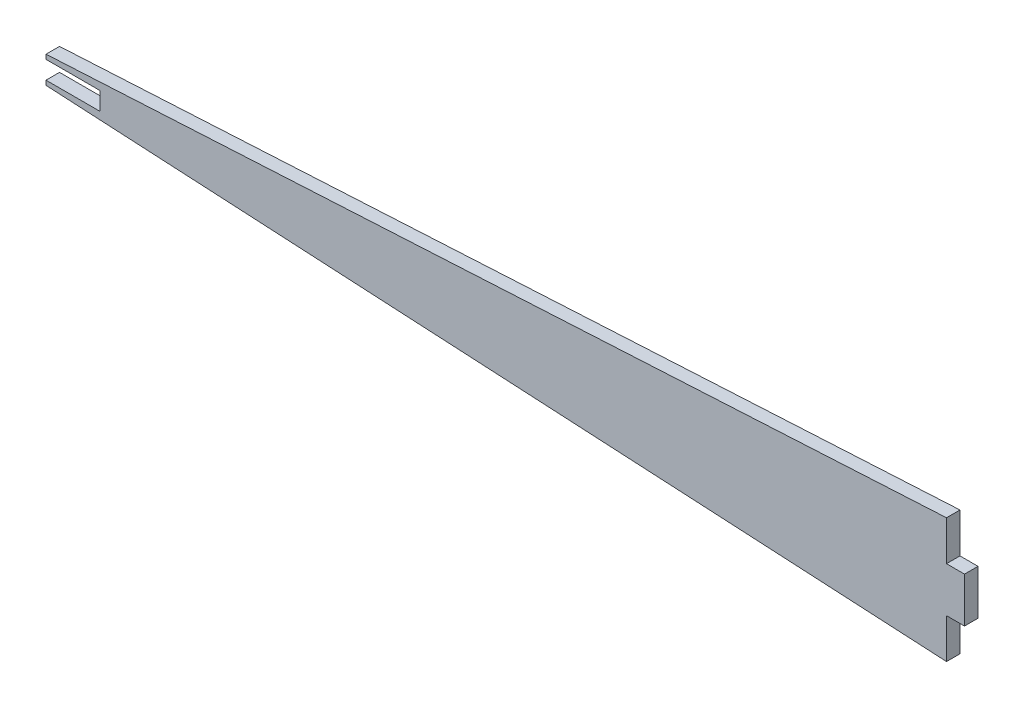
ISO-10303-21;
HEADER;
FILE_DESCRIPTION(('STEP AP214'),'2;1');
FILE_NAME('part.step','',(''),(''),'','','');
FILE_SCHEMA(('AUTOMOTIVE_DESIGN { 1 0 10303 214 1 1 1 1 }'));
ENDSEC;
DATA;
#1=APPLICATION_CONTEXT('core data for automotive mechanical design processes');
#2=APPLICATION_PROTOCOL_DEFINITION('international standard','automotive_design',2000,#1);
#3=PRODUCT_CONTEXT('',#1,'mechanical');
#4=PRODUCT('Part','Part','',(#3));
#5=PRODUCT_RELATED_PRODUCT_CATEGORY('part','',(#4));
#6=PRODUCT_DEFINITION_FORMATION('','',#4);
#7=PRODUCT_DEFINITION_CONTEXT('part definition',#1,'design');
#8=PRODUCT_DEFINITION('design','',#6,#7);
#9=PRODUCT_DEFINITION_SHAPE('','',#8);
#10=(LENGTH_UNIT() NAMED_UNIT(*) SI_UNIT(.MILLI.,.METRE.));
#11=(NAMED_UNIT(*) PLANE_ANGLE_UNIT() SI_UNIT($,.RADIAN.));
#12=(NAMED_UNIT(*) SI_UNIT($,.STERADIAN.) SOLID_ANGLE_UNIT());
#13=UNCERTAINTY_MEASURE_WITH_UNIT(LENGTH_MEASURE(1.E-05),#10,'distance_accuracy_value','');
#14=(GEOMETRIC_REPRESENTATION_CONTEXT(3) GLOBAL_UNCERTAINTY_ASSIGNED_CONTEXT((#13)) GLOBAL_UNIT_ASSIGNED_CONTEXT((#10,
#11,#12)) REPRESENTATION_CONTEXT('',''));
#15=CARTESIAN_POINT('',(0.,0.,0.));
#16=DIRECTION('',(0.,0.,1.));
#17=DIRECTION('',(1.,0.,0.));
#18=AXIS2_PLACEMENT_3D('',#15,#16,#17);
#19=CARTESIAN_POINT('',(100.818561425345,0.588779311900424,1.5));
#20=DIRECTION('',(0.0541045442753656,0.998535276436819,0.));
#21=DIRECTION('',(-0.998535276436819,0.0541045442753657,0.));
#22=AXIS2_PLACEMENT_3D('',#19,#20,#21);
#23=PLANE('',#22);
#24=DIRECTION('',(0.998535276436819,-0.0541045442753657,0.));
#25=VECTOR('',#24,1.);
#26=CARTESIAN_POINT('',(100.818561425345,0.588779311900424,0.));
#27=LINE('',#26,#25);
#28=CARTESIAN_POINT('',(0.75936142534502,6.0103778716186,0.));
#29=VERTEX_POINT('',#28);
#30=CARTESIAN_POINT('',(100.818561425345,0.588779311900424,0.));
#31=VERTEX_POINT('',#30);
#32=EDGE_CURVE('E152',#29,#31,#27,.T.);
#33=ORIENTED_EDGE('',*,*,#32,.T.);
#34=DIRECTION('',(0.,0.,-1.));
#35=VECTOR('',#34,1.);
#36=CARTESIAN_POINT('',(100.818561425345,0.588779311900424,1.5));
#37=LINE('',#36,#35);
#38=CARTESIAN_POINT('',(100.818561425345,0.588779311900424,1.5));
#39=VERTEX_POINT('',#38);
#40=EDGE_CURVE('E11',#39,#31,#37,.T.);
#41=ORIENTED_EDGE('',*,*,#40,.F.);
#42=DIRECTION('',(0.998535276436819,-0.0541045442753657,0.));
#43=VECTOR('',#42,1.);
#44=CARTESIAN_POINT('',(100.818561425345,0.588779311900424,1.5));
#45=LINE('',#44,#43);
#46=CARTESIAN_POINT('',(0.75936142534502,6.0103778716186,1.5));
#47=VERTEX_POINT('',#46);
#48=EDGE_CURVE('E175',#47,#39,#45,.T.);
#49=ORIENTED_EDGE('',*,*,#48,.F.);
#50=DIRECTION('',(0.,0.,-1.));
#51=VECTOR('',#50,1.);
#52=CARTESIAN_POINT('',(0.75936142534502,6.0103778716186,1.5));
#53=LINE('',#52,#51);
#54=EDGE_CURVE('E148',#47,#29,#53,.T.);
#55=ORIENTED_EDGE('',*,*,#54,.T.);
#56=EDGE_LOOP('',(#33,#41,#49,#55));
#57=FACE_BOUND('',#56,.T.);
#58=ADVANCED_FACE('F33',(#57),#23,.F.);
#59=CARTESIAN_POINT('',(100.818561425345,0.588779311900424,1.5));
#60=DIRECTION('',(-1.,0.,0.));
#61=DIRECTION('',(0.,0.,1.));
#62=AXIS2_PLACEMENT_3D('',#59,#60,#61);
#63=PLANE('',#62);
#64=DIRECTION('',(0.,1.,0.));
#65=VECTOR('',#64,1.);
#66=CARTESIAN_POINT('',(100.818561425345,0.588779311900424,0.));
#67=LINE('',#66,#65);
#68=CARTESIAN_POINT('',(100.818561425345,5.0103778716186,0.));
#69=VERTEX_POINT('',#68);
#70=EDGE_CURVE('E155',#31,#69,#67,.T.);
#71=ORIENTED_EDGE('',*,*,#70,.T.);
#72=DIRECTION('',(0.,0.,-1.));
#73=VECTOR('',#72,1.);
#74=CARTESIAN_POINT('',(100.818561425345,5.0103778716186,1.5));
#75=LINE('',#74,#73);
#76=CARTESIAN_POINT('',(100.818561425345,5.0103778716186,1.5));
#77=VERTEX_POINT('',#76);
#78=EDGE_CURVE('E41',#77,#69,#75,.T.);
#79=ORIENTED_EDGE('',*,*,#78,.F.);
#80=DIRECTION('',(0.,1.,0.));
#81=VECTOR('',#80,1.);
#82=CARTESIAN_POINT('',(100.818561425345,0.588779311900424,1.5));
#83=LINE('',#82,#81);
#84=EDGE_CURVE('E104',#39,#77,#83,.T.);
#85=ORIENTED_EDGE('',*,*,#84,.F.);
#86=ORIENTED_EDGE('',*,*,#40,.T.);
#87=EDGE_LOOP('',(#71,#79,#85,#86));
#88=FACE_BOUND('',#87,.T.);
#89=ADVANCED_FACE('F254',(#88),#63,.F.);
#90=CARTESIAN_POINT('',(102.818561425345,5.0103778716186,1.5));
#91=DIRECTION('',(0.,1.,0.));
#92=DIRECTION('',(0.,0.,1.));
#93=AXIS2_PLACEMENT_3D('',#90,#91,#92);
#94=PLANE('',#93);
#95=DIRECTION('',(1.,0.,0.));
#96=VECTOR('',#95,1.);
#97=CARTESIAN_POINT('',(102.818561425345,5.0103778716186,0.));
#98=LINE('',#97,#96);
#99=CARTESIAN_POINT('',(102.818561425345,5.0103778716186,0.));
#100=VERTEX_POINT('',#99);
#101=EDGE_CURVE('E157',#69,#100,#98,.T.);
#102=ORIENTED_EDGE('',*,*,#101,.T.);
#103=DIRECTION('',(0.,0.,-1.));
#104=VECTOR('',#103,1.);
#105=CARTESIAN_POINT('',(102.818561425345,5.0103778716186,1.5));
#106=LINE('',#105,#104);
#107=CARTESIAN_POINT('',(102.818561425345,5.0103778716186,1.5));
#108=VERTEX_POINT('',#107);
#109=EDGE_CURVE('E194',#108,#100,#106,.T.);
#110=ORIENTED_EDGE('',*,*,#109,.F.);
#111=DIRECTION('',(1.,0.,0.));
#112=VECTOR('',#111,1.);
#113=CARTESIAN_POINT('',(102.818561425345,5.0103778716186,1.5));
#114=LINE('',#113,#112);
#115=EDGE_CURVE('E202',#77,#108,#114,.T.);
#116=ORIENTED_EDGE('',*,*,#115,.F.);
#117=ORIENTED_EDGE('',*,*,#78,.T.);
#118=EDGE_LOOP('',(#102,#110,#116,#117));
#119=FACE_BOUND('',#118,.T.);
#120=ADVANCED_FACE('F200',(#119),#94,.F.);
#121=CARTESIAN_POINT('',(102.818561425345,10.0103778716186,1.5));
#122=DIRECTION('',(-1.,0.,0.));
#123=DIRECTION('',(0.,0.,1.));
#124=AXIS2_PLACEMENT_3D('',#121,#122,#123);
#125=PLANE('',#124);
#126=DIRECTION('',(0.,1.,0.));
#127=VECTOR('',#126,1.);
#128=CARTESIAN_POINT('',(102.818561425345,10.0103778716186,0.));
#129=LINE('',#128,#127);
#130=CARTESIAN_POINT('',(102.818561425345,10.0103778716186,0.));
#131=VERTEX_POINT('',#130);
#132=EDGE_CURVE('E159',#100,#131,#129,.T.);
#133=ORIENTED_EDGE('',*,*,#132,.T.);
#134=DIRECTION('',(0.,0.,-1.));
#135=VECTOR('',#134,1.);
#136=CARTESIAN_POINT('',(102.818561425345,10.0103778716186,1.5));
#137=LINE('',#136,#135);
#138=CARTESIAN_POINT('',(102.818561425345,10.0103778716186,1.5));
#139=VERTEX_POINT('',#138);
#140=EDGE_CURVE('E191',#139,#131,#137,.T.);
#141=ORIENTED_EDGE('',*,*,#140,.F.);
#142=DIRECTION('',(0.,1.,0.));
#143=VECTOR('',#142,1.);
#144=CARTESIAN_POINT('',(102.818561425345,10.0103778716186,1.5));
#145=LINE('',#144,#143);
#146=EDGE_CURVE('E220',#108,#139,#145,.T.);
#147=ORIENTED_EDGE('',*,*,#146,.F.);
#148=ORIENTED_EDGE('',*,*,#109,.T.);
#149=EDGE_LOOP('',(#133,#141,#147,#148));
#150=FACE_BOUND('',#149,.T.);
#151=ADVANCED_FACE('F211',(#150),#125,.F.);
#152=CARTESIAN_POINT('',(100.818561425345,10.0103778716186,1.5));
#153=DIRECTION('',(0.,-1.,0.));
#154=DIRECTION('',(0.,0.,-1.));
#155=AXIS2_PLACEMENT_3D('',#152,#153,#154);
#156=PLANE('',#155);
#157=DIRECTION('',(-1.,0.,0.));
#158=VECTOR('',#157,1.);
#159=CARTESIAN_POINT('',(100.818561425345,10.0103778716186,0.));
#160=LINE('',#159,#158);
#161=CARTESIAN_POINT('',(100.818561425345,10.0103778716186,0.));
#162=VERTEX_POINT('',#161);
#163=EDGE_CURVE('E161',#131,#162,#160,.T.);
#164=ORIENTED_EDGE('',*,*,#163,.T.);
#165=DIRECTION('',(0.,0.,-1.));
#166=VECTOR('',#165,1.);
#167=CARTESIAN_POINT('',(100.818561425345,10.0103778716186,1.5));
#168=LINE('',#167,#166);
#169=CARTESIAN_POINT('',(100.818561425345,10.0103778716186,1.5));
#170=VERTEX_POINT('',#169);
#171=EDGE_CURVE('E188',#170,#162,#168,.T.);
#172=ORIENTED_EDGE('',*,*,#171,.F.);
#173=DIRECTION('',(-1.,0.,0.));
#174=VECTOR('',#173,1.);
#175=CARTESIAN_POINT('',(100.818561425345,10.0103778716186,1.5));
#176=LINE('',#175,#174);
#177=EDGE_CURVE('E217',#139,#170,#176,.T.);
#178=ORIENTED_EDGE('',*,*,#177,.F.);
#179=ORIENTED_EDGE('',*,*,#140,.T.);
#180=EDGE_LOOP('',(#164,#172,#178,#179));
#181=FACE_BOUND('',#180,.T.);
#182=ADVANCED_FACE('F215',(#181),#156,.F.);
#183=CARTESIAN_POINT('',(100.818561425345,10.0103778716186,1.5));
#184=DIRECTION('',(-1.,0.,0.));
#185=DIRECTION('',(0.,0.,1.));
#186=AXIS2_PLACEMENT_3D('',#183,#184,#185);
#187=PLANE('',#186);
#188=DIRECTION('',(0.,1.,0.));
#189=VECTOR('',#188,1.);
#190=CARTESIAN_POINT('',(100.818561425345,10.0103778716186,0.));
#191=LINE('',#190,#189);
#192=CARTESIAN_POINT('',(100.818561425345,14.4319787307595,0.));
#193=VERTEX_POINT('',#192);
#194=EDGE_CURVE('E163',#162,#193,#191,.T.);
#195=ORIENTED_EDGE('',*,*,#194,.T.);
#196=DIRECTION('',(0.,0.,-1.));
#197=VECTOR('',#196,1.);
#198=CARTESIAN_POINT('',(100.818561425345,14.4319787307595,1.5));
#199=LINE('',#198,#197);
#200=CARTESIAN_POINT('',(100.818561425345,14.4319787307595,1.5));
#201=VERTEX_POINT('',#200);
#202=EDGE_CURVE('E185',#201,#193,#199,.T.);
#203=ORIENTED_EDGE('',*,*,#202,.F.);
#204=DIRECTION('',(0.,1.,0.));
#205=VECTOR('',#204,1.);
#206=CARTESIAN_POINT('',(100.818561425345,10.0103778716186,1.5));
#207=LINE('',#206,#205);
#208=EDGE_CURVE('E219',#170,#201,#207,.T.);
#209=ORIENTED_EDGE('',*,*,#208,.F.);
#210=ORIENTED_EDGE('',*,*,#171,.T.);
#211=EDGE_LOOP('',(#195,#203,#209,#210));
#212=FACE_BOUND('',#211,.T.);
#213=ADVANCED_FACE('F267',(#212),#187,.F.);
#214=CARTESIAN_POINT('',(0.75936142534502,9.0103778716186,1.5));
#215=DIRECTION('',(0.0541045671551552,-0.998535275197103,0.));
#216=DIRECTION('',(0.998535275197103,0.0541045671551552,0.));
#217=AXIS2_PLACEMENT_3D('',#214,#215,#216);
#218=PLANE('',#217);
#219=DIRECTION('',(-0.998535275197103,-0.0541045671551552,0.));
#220=VECTOR('',#219,1.);
#221=CARTESIAN_POINT('',(0.75936142534502,9.0103778716186,0.));
#222=LINE('',#221,#220);
#223=CARTESIAN_POINT('',(0.75936142534502,9.0103778716186,0.));
#224=VERTEX_POINT('',#223);
#225=EDGE_CURVE('E165',#193,#224,#222,.T.);
#226=ORIENTED_EDGE('',*,*,#225,.T.);
#227=DIRECTION('',(0.,0.,-1.));
#228=VECTOR('',#227,1.);
#229=CARTESIAN_POINT('',(0.75936142534502,9.0103778716186,1.5));
#230=LINE('',#229,#228);
#231=CARTESIAN_POINT('',(0.75936142534502,9.0103778716186,1.5));
#232=VERTEX_POINT('',#231);
#233=EDGE_CURVE('E182',#232,#224,#230,.T.);
#234=ORIENTED_EDGE('',*,*,#233,.F.);
#235=DIRECTION('',(-0.998535275197103,-0.0541045671551552,0.));
#236=VECTOR('',#235,1.);
#237=CARTESIAN_POINT('',(0.75936142534502,9.0103778716186,1.5));
#238=LINE('',#237,#236);
#239=EDGE_CURVE('E222',#201,#232,#238,.T.);
#240=ORIENTED_EDGE('',*,*,#239,.F.);
#241=ORIENTED_EDGE('',*,*,#202,.T.);
#242=EDGE_LOOP('',(#226,#234,#240,#241));
#243=FACE_BOUND('',#242,.T.);
#244=ADVANCED_FACE('F270',(#243),#218,.F.);
#245=CARTESIAN_POINT('',(0.75936142534502,9.0103778716186,1.5));
#246=DIRECTION('',(1.,0.,0.));
#247=DIRECTION('',(0.,0.,-1.));
#248=AXIS2_PLACEMENT_3D('',#245,#246,#247);
#249=PLANE('',#248);
#250=DIRECTION('',(0.,-1.,0.));
#251=VECTOR('',#250,1.);
#252=CARTESIAN_POINT('',(0.75936142534502,9.0103778716186,0.));
#253=LINE('',#252,#251);
#254=CARTESIAN_POINT('',(0.75936142534502,8.5103778716186,0.));
#255=VERTEX_POINT('',#254);
#256=EDGE_CURVE('E167',#224,#255,#253,.T.);
#257=ORIENTED_EDGE('',*,*,#256,.T.);
#258=DIRECTION('',(0.,0.,-1.));
#259=VECTOR('',#258,1.);
#260=CARTESIAN_POINT('',(0.75936142534502,8.5103778716186,1.5));
#261=LINE('',#260,#259);
#262=CARTESIAN_POINT('',(0.75936142534502,8.5103778716186,1.5));
#263=VERTEX_POINT('',#262);
#264=EDGE_CURVE('E179',#263,#255,#261,.T.);
#265=ORIENTED_EDGE('',*,*,#264,.F.);
#266=DIRECTION('',(0.,-1.,0.));
#267=VECTOR('',#266,1.);
#268=CARTESIAN_POINT('',(0.75936142534502,9.0103778716186,1.5));
#269=LINE('',#268,#267);
#270=EDGE_CURVE('E228',#232,#263,#269,.T.);
#271=ORIENTED_EDGE('',*,*,#270,.F.);
#272=ORIENTED_EDGE('',*,*,#233,.T.);
#273=EDGE_LOOP('',(#257,#265,#271,#272));
#274=FACE_BOUND('',#273,.T.);
#275=ADVANCED_FACE('F234',(#274),#249,.F.);
#276=CARTESIAN_POINT('',(0.75936142534502,8.5103778716186,1.5));
#277=DIRECTION('',(0.,1.,0.));
#278=DIRECTION('',(0.,0.,1.));
#279=AXIS2_PLACEMENT_3D('',#276,#277,#278);
#280=PLANE('',#279);
#281=DIRECTION('',(1.,0.,0.));
#282=VECTOR('',#281,1.);
#283=CARTESIAN_POINT('',(0.75936142534502,8.5103778716186,0.));
#284=LINE('',#283,#282);
#285=CARTESIAN_POINT('',(6.75936142534502,8.5103778716186,0.));
#286=VERTEX_POINT('',#285);
#287=EDGE_CURVE('E169',#255,#286,#284,.T.);
#288=ORIENTED_EDGE('',*,*,#287,.T.);
#289=DIRECTION('',(0.,0.,-1.));
#290=VECTOR('',#289,1.);
#291=CARTESIAN_POINT('',(6.75936142534502,8.5103778716186,1.5));
#292=LINE('',#291,#290);
#293=CARTESIAN_POINT('',(6.75936142534502,8.5103778716186,1.5));
#294=VERTEX_POINT('',#293);
#295=EDGE_CURVE('E143',#294,#286,#292,.T.);
#296=ORIENTED_EDGE('',*,*,#295,.F.);
#297=DIRECTION('',(1.,0.,0.));
#298=VECTOR('',#297,1.);
#299=CARTESIAN_POINT('',(0.75936142534502,8.5103778716186,1.5));
#300=LINE('',#299,#298);
#301=EDGE_CURVE('E135',#263,#294,#300,.T.);
#302=ORIENTED_EDGE('',*,*,#301,.F.);
#303=ORIENTED_EDGE('',*,*,#264,.T.);
#304=EDGE_LOOP('',(#288,#296,#302,#303));
#305=FACE_BOUND('',#304,.T.);
#306=ADVANCED_FACE('F238',(#305),#280,.F.);
#307=CARTESIAN_POINT('',(6.75936142534502,7.5103778716186,1.5));
#308=DIRECTION('',(1.,0.,0.));
#309=DIRECTION('',(0.,0.,-1.));
#310=AXIS2_PLACEMENT_3D('',#307,#308,#309);
#311=PLANE('',#310);
#312=DIRECTION('',(0.,-1.,0.));
#313=VECTOR('',#312,1.);
#314=CARTESIAN_POINT('',(6.75936142534502,7.5103778716186,0.));
#315=LINE('',#314,#313);
#316=CARTESIAN_POINT('',(6.75936142534502,6.5103778716186,0.));
#317=VERTEX_POINT('',#316);
#318=EDGE_CURVE('E142',#286,#317,#315,.T.);
#319=ORIENTED_EDGE('',*,*,#318,.T.);
#320=DIRECTION('',(0.,0.,-1.));
#321=VECTOR('',#320,1.);
#322=CARTESIAN_POINT('',(6.75936142534502,6.5103778716186,1.5));
#323=LINE('',#322,#321);
#324=CARTESIAN_POINT('',(6.75936142534502,6.5103778716186,1.5));
#325=VERTEX_POINT('',#324);
#326=EDGE_CURVE('E140',#325,#317,#323,.T.);
#327=ORIENTED_EDGE('',*,*,#326,.F.);
#328=DIRECTION('',(0.,-1.,0.));
#329=VECTOR('',#328,1.);
#330=CARTESIAN_POINT('',(6.75936142534502,7.5103778716186,1.5));
#331=LINE('',#330,#329);
#332=EDGE_CURVE('E129',#294,#325,#331,.T.);
#333=ORIENTED_EDGE('',*,*,#332,.F.);
#334=ORIENTED_EDGE('',*,*,#295,.T.);
#335=EDGE_LOOP('',(#319,#327,#333,#334));
#336=FACE_BOUND('',#335,.T.);
#337=ADVANCED_FACE('F141',(#336),#311,.F.);
#338=CARTESIAN_POINT('',(0.75936142534502,6.5103778716186,1.5));
#339=DIRECTION('',(0.,-1.,0.));
#340=DIRECTION('',(0.,0.,-1.));
#341=AXIS2_PLACEMENT_3D('',#338,#339,#340);
#342=PLANE('',#341);
#343=DIRECTION('',(-1.,0.,0.));
#344=VECTOR('',#343,1.);
#345=CARTESIAN_POINT('',(0.75936142534502,6.5103778716186,0.));
#346=LINE('',#345,#344);
#347=CARTESIAN_POINT('',(0.75936142534502,6.5103778716186,0.));
#348=VERTEX_POINT('',#347);
#349=EDGE_CURVE('E90',#317,#348,#346,.T.);
#350=ORIENTED_EDGE('',*,*,#349,.T.);
#351=DIRECTION('',(0.,0.,-1.));
#352=VECTOR('',#351,1.);
#353=CARTESIAN_POINT('',(0.75936142534502,6.5103778716186,1.5));
#354=LINE('',#353,#352);
#355=CARTESIAN_POINT('',(0.75936142534502,6.5103778716186,1.5));
#356=VERTEX_POINT('',#355);
#357=EDGE_CURVE('E144',#356,#348,#354,.T.);
#358=ORIENTED_EDGE('',*,*,#357,.F.);
#359=DIRECTION('',(-1.,0.,0.));
#360=VECTOR('',#359,1.);
#361=CARTESIAN_POINT('',(0.75936142534502,6.5103778716186,1.5));
#362=LINE('',#361,#360);
#363=EDGE_CURVE('E133',#325,#356,#362,.T.);
#364=ORIENTED_EDGE('',*,*,#363,.F.);
#365=ORIENTED_EDGE('',*,*,#326,.T.);
#366=EDGE_LOOP('',(#350,#358,#364,#365));
#367=FACE_BOUND('',#366,.T.);
#368=ADVANCED_FACE('F146',(#367),#342,.F.);
#369=CARTESIAN_POINT('',(0.75936142534502,6.5103778716186,1.5));
#370=DIRECTION('',(1.,0.,0.));
#371=DIRECTION('',(0.,0.,-1.));
#372=AXIS2_PLACEMENT_3D('',#369,#370,#371);
#373=PLANE('',#372);
#374=DIRECTION('',(0.,-1.,0.));
#375=VECTOR('',#374,1.);
#376=CARTESIAN_POINT('',(0.75936142534502,6.5103778716186,0.));
#377=LINE('',#376,#375);
#378=EDGE_CURVE('E96',#348,#29,#377,.T.);
#379=ORIENTED_EDGE('',*,*,#378,.T.);
#380=ORIENTED_EDGE('',*,*,#54,.F.);
#381=DIRECTION('',(0.,-1.,0.));
#382=VECTOR('',#381,1.);
#383=CARTESIAN_POINT('',(0.75936142534502,6.5103778716186,1.5));
#384=LINE('',#383,#382);
#385=EDGE_CURVE('E49',#356,#47,#384,.T.);
#386=ORIENTED_EDGE('',*,*,#385,.F.);
#387=ORIENTED_EDGE('',*,*,#357,.T.);
#388=EDGE_LOOP('',(#379,#380,#386,#387));
#389=FACE_BOUND('',#388,.T.);
#390=ADVANCED_FACE('F243',(#389),#373,.F.);
#391=CARTESIAN_POINT('',(0.,0.,1.5));
#392=DIRECTION('',(0.,0.,1.));
#393=DIRECTION('',(1.,0.,0.));
#394=AXIS2_PLACEMENT_3D('',#391,#392,#393);
#395=PLANE('',#394);
#396=ORIENTED_EDGE('',*,*,#48,.T.);
#397=ORIENTED_EDGE('',*,*,#84,.T.);
#398=ORIENTED_EDGE('',*,*,#115,.T.);
#399=ORIENTED_EDGE('',*,*,#146,.T.);
#400=ORIENTED_EDGE('',*,*,#177,.T.);
#401=ORIENTED_EDGE('',*,*,#208,.T.);
#402=ORIENTED_EDGE('',*,*,#239,.T.);
#403=ORIENTED_EDGE('',*,*,#270,.T.);
#404=ORIENTED_EDGE('',*,*,#301,.T.);
#405=ORIENTED_EDGE('',*,*,#332,.T.);
#406=ORIENTED_EDGE('',*,*,#363,.T.);
#407=ORIENTED_EDGE('',*,*,#385,.T.);
#408=EDGE_LOOP('',(#396,#397,#398,#399,#400,#401,#402,#403,#404,#405,#406,#407));
#409=FACE_BOUND('',#408,.T.);
#410=ADVANCED_FACE('F131',(#409),#395,.T.);
#411=CARTESIAN_POINT('',(0.,0.,0.));
#412=DIRECTION('',(0.,0.,1.));
#413=DIRECTION('',(1.,0.,0.));
#414=AXIS2_PLACEMENT_3D('',#411,#412,#413);
#415=PLANE('',#414);
#416=ORIENTED_EDGE('',*,*,#32,.F.);
#417=ORIENTED_EDGE('',*,*,#378,.F.);
#418=ORIENTED_EDGE('',*,*,#349,.F.);
#419=ORIENTED_EDGE('',*,*,#318,.F.);
#420=ORIENTED_EDGE('',*,*,#287,.F.);
#421=ORIENTED_EDGE('',*,*,#256,.F.);
#422=ORIENTED_EDGE('',*,*,#225,.F.);
#423=ORIENTED_EDGE('',*,*,#194,.F.);
#424=ORIENTED_EDGE('',*,*,#163,.F.);
#425=ORIENTED_EDGE('',*,*,#132,.F.);
#426=ORIENTED_EDGE('',*,*,#101,.F.);
#427=ORIENTED_EDGE('',*,*,#70,.F.);
#428=EDGE_LOOP('',(#416,#417,#418,#419,#420,#421,#422,#423,#424,#425,#426,#427));
#429=FACE_BOUND('',#428,.T.);
#430=ADVANCED_FACE('F206',(#429),#415,.F.);
#431=CLOSED_SHELL('',(#58,#89,#120,#151,#182,#213,#244,#275,#306,#337,#368,#390,#410,#430));
#432=MANIFOLD_SOLID_BREP('B2',#431);
#433=ADVANCED_BREP_SHAPE_REPRESENTATION('',(#18,#432),#14);
#434=SHAPE_DEFINITION_REPRESENTATION(#9,#433);
ENDSEC;
END-ISO-10303-21;
